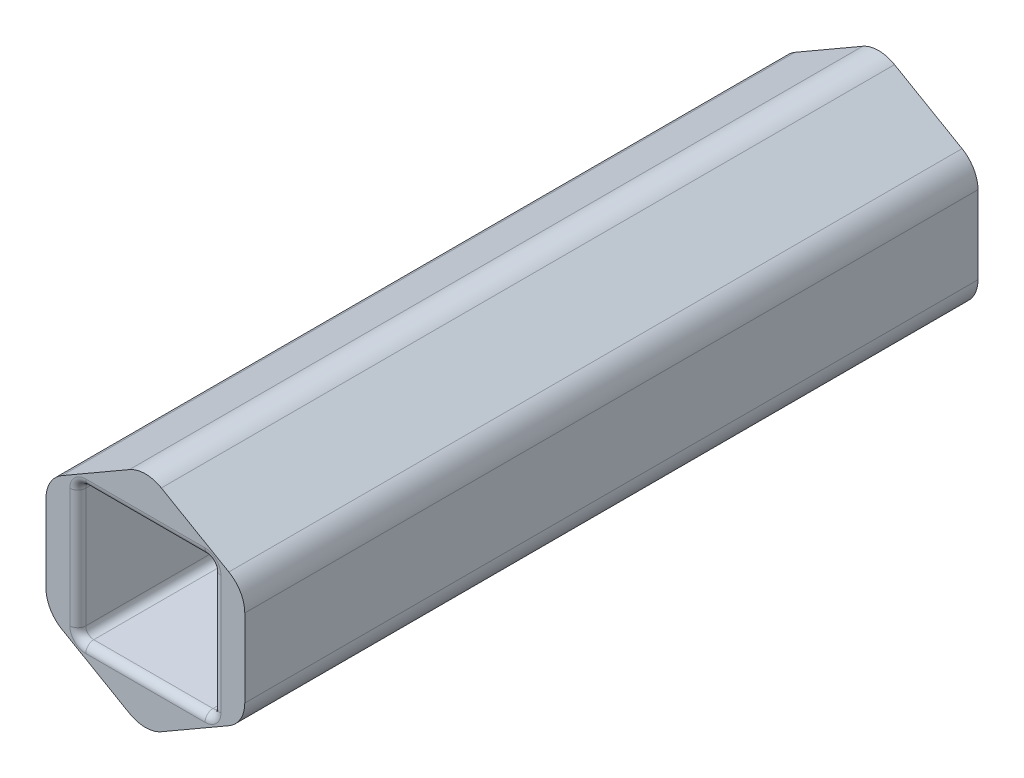
ISO-10303-21;
HEADER;
FILE_DESCRIPTION(('STEP AP214'),'2;1');
FILE_NAME('part.step','',(''),(''),'','','');
FILE_SCHEMA(('AUTOMOTIVE_DESIGN { 1 0 10303 214 1 1 1 1 }'));
ENDSEC;
DATA;
#1=APPLICATION_CONTEXT('core data for automotive mechanical design processes');
#2=APPLICATION_PROTOCOL_DEFINITION('international standard','automotive_design',2000,#1);
#3=PRODUCT_CONTEXT('',#1,'mechanical');
#4=PRODUCT('Part','Part','',(#3));
#5=PRODUCT_RELATED_PRODUCT_CATEGORY('part','',(#4));
#6=PRODUCT_DEFINITION_FORMATION('','',#4);
#7=PRODUCT_DEFINITION_CONTEXT('part definition',#1,'design');
#8=PRODUCT_DEFINITION('design','',#6,#7);
#9=PRODUCT_DEFINITION_SHAPE('','',#8);
#10=(LENGTH_UNIT() NAMED_UNIT(*) SI_UNIT(.MILLI.,.METRE.));
#11=(NAMED_UNIT(*) PLANE_ANGLE_UNIT() SI_UNIT($,.RADIAN.));
#12=(NAMED_UNIT(*) SI_UNIT($,.STERADIAN.) SOLID_ANGLE_UNIT());
#13=UNCERTAINTY_MEASURE_WITH_UNIT(LENGTH_MEASURE(1.E-05),#10,'distance_accuracy_value','');
#14=(GEOMETRIC_REPRESENTATION_CONTEXT(3) GLOBAL_UNCERTAINTY_ASSIGNED_CONTEXT((#13)) GLOBAL_UNIT_ASSIGNED_CONTEXT((#10,
#11,#12)) REPRESENTATION_CONTEXT('',''));
#15=CARTESIAN_POINT('',(0.,0.,0.));
#16=DIRECTION('',(0.,0.,1.));
#17=DIRECTION('',(1.,0.,0.));
#18=AXIS2_PLACEMENT_3D('',#15,#16,#17);
#19=CARTESIAN_POINT('',(0.,0.,36.5125));
#20=DIRECTION('',(0.,0.,1.));
#21=DIRECTION('',(1.,0.,0.));
#22=AXIS2_PLACEMENT_3D('',#19,#20,#21);
#23=PLANE('',#22);
#24=CARTESIAN_POINT('',(-2.968625,-2.968625,36.5125));
#25=DIRECTION('',(0.,0.,1.));
#26=DIRECTION('',(1.,0.,0.));
#27=AXIS2_PLACEMENT_3D('',#24,#25,#26);
#28=CIRCLE('',#27,0.79375);
#29=CARTESIAN_POINT('',(-3.762375,-2.968625,36.5125));
#30=VERTEX_POINT('',#29);
#31=CARTESIAN_POINT('',(-2.968625,-3.762375,36.5125));
#32=VERTEX_POINT('',#31);
#33=EDGE_CURVE('E355',#30,#32,#28,.T.);
#34=ORIENTED_EDGE('',*,*,#33,.F.);
#35=DIRECTION('',(0.,-1.,0.));
#36=VECTOR('',#35,1.);
#37=CARTESIAN_POINT('',(-3.762375,0.,36.5125));
#38=LINE('',#37,#36);
#39=CARTESIAN_POINT('',(-3.762375,2.968625,36.5125));
#40=VERTEX_POINT('',#39);
#41=EDGE_CURVE('E359',#30,#40,#38,.F.);
#42=ORIENTED_EDGE('',*,*,#41,.T.);
#43=CARTESIAN_POINT('',(-2.968625,2.968625,36.5125));
#44=DIRECTION('',(0.,0.,1.));
#45=DIRECTION('',(1.,0.,0.));
#46=AXIS2_PLACEMENT_3D('',#43,#44,#45);
#47=CIRCLE('',#46,0.79375);
#48=CARTESIAN_POINT('',(-2.968625,3.762375,36.5125));
#49=VERTEX_POINT('',#48);
#50=EDGE_CURVE('E356',#49,#40,#47,.T.);
#51=ORIENTED_EDGE('',*,*,#50,.F.);
#52=DIRECTION('',(-1.,0.,0.));
#53=VECTOR('',#52,1.);
#54=CARTESIAN_POINT('',(0.,3.762375,36.5125));
#55=LINE('',#54,#53);
#56=CARTESIAN_POINT('',(2.968625,3.762375,36.5125));
#57=VERTEX_POINT('',#56);
#58=EDGE_CURVE('E346',#49,#57,#55,.F.);
#59=ORIENTED_EDGE('',*,*,#58,.T.);
#60=CARTESIAN_POINT('',(2.968625,2.968625,36.5125));
#61=DIRECTION('',(0.,0.,1.));
#62=DIRECTION('',(1.,0.,0.));
#63=AXIS2_PLACEMENT_3D('',#60,#61,#62);
#64=CIRCLE('',#63,0.79375);
#65=CARTESIAN_POINT('',(3.762375,2.968625,36.5125));
#66=VERTEX_POINT('',#65);
#67=EDGE_CURVE('E342',#66,#57,#64,.T.);
#68=ORIENTED_EDGE('',*,*,#67,.F.);
#69=DIRECTION('',(0.,1.,0.));
#70=VECTOR('',#69,1.);
#71=CARTESIAN_POINT('',(3.762375,0.,36.5125));
#72=LINE('',#71,#70);
#73=CARTESIAN_POINT('',(3.762375,-2.968625,36.5125));
#74=VERTEX_POINT('',#73);
#75=EDGE_CURVE('E339',#66,#74,#72,.F.);
#76=ORIENTED_EDGE('',*,*,#75,.T.);
#77=CARTESIAN_POINT('',(2.968625,-2.968625,36.5125));
#78=DIRECTION('',(0.,0.,1.));
#79=DIRECTION('',(1.,0.,0.));
#80=AXIS2_PLACEMENT_3D('',#77,#78,#79);
#81=CIRCLE('',#80,0.79375);
#82=CARTESIAN_POINT('',(2.968625,-3.762375,36.5125));
#83=VERTEX_POINT('',#82);
#84=EDGE_CURVE('E337',#83,#74,#81,.T.);
#85=ORIENTED_EDGE('',*,*,#84,.F.);
#86=DIRECTION('',(1.,0.,0.));
#87=VECTOR('',#86,1.);
#88=CARTESIAN_POINT('',(0.,-3.762375,36.5125));
#89=LINE('',#88,#87);
#90=EDGE_CURVE('E345',#83,#32,#89,.F.);
#91=ORIENTED_EDGE('',*,*,#90,.T.);
#92=EDGE_LOOP('',(#34,#42,#51,#59,#68,#76,#85,#91));
#93=FACE_BOUND('',#92,.T.);
#94=DIRECTION('',(0.,1.,0.));
#95=VECTOR('',#94,1.);
#96=CARTESIAN_POINT('',(4.94933518262806,-2.8575,36.5125));
#97=LINE('',#96,#95);
#98=CARTESIAN_POINT('',(4.94933518262806,-1.94095644766147,36.5125));
#99=VERTEX_POINT('',#98);
#100=CARTESIAN_POINT('',(4.94933518262806,1.94095644766147,36.5125));
#101=VERTEX_POINT('',#100);
#102=EDGE_CURVE('E609',#99,#101,#97,.T.);
#103=ORIENTED_EDGE('',*,*,#102,.T.);
#104=CARTESIAN_POINT('',(3.36183518262806,1.94095644766147,36.5125));
#105=DIRECTION('',(0.,0.,1.));
#106=DIRECTION('',(1.,0.,0.));
#107=AXIS2_PLACEMENT_3D('',#104,#105,#106);
#108=CIRCLE('',#107,1.5875);
#109=CARTESIAN_POINT('',(4.15558518262806,3.31577177616927,36.5125));
#110=VERTEX_POINT('',#109);
#111=EDGE_CURVE('E543',#101,#110,#108,.T.);
#112=ORIENTED_EDGE('',*,*,#111,.T.);
#113=DIRECTION('',(-0.866025403784439,0.5,0.));
#114=VECTOR('',#113,1.);
#115=CARTESIAN_POINT('',(4.94933518262806,2.8575,36.5125));
#116=LINE('',#115,#114);
#117=CARTESIAN_POINT('',(0.793749999999999,5.25672822383074,36.5125));
#118=VERTEX_POINT('',#117);
#119=EDGE_CURVE('E603',#110,#118,#116,.T.);
#120=ORIENTED_EDGE('',*,*,#119,.T.);
#121=CARTESIAN_POINT('',(0.,3.88191289532294,36.5125));
#122=DIRECTION('',(0.,0.,1.));
#123=DIRECTION('',(1.,0.,0.));
#124=AXIS2_PLACEMENT_3D('',#121,#122,#123);
#125=CIRCLE('',#124,1.5875);
#126=CARTESIAN_POINT('',(-0.79375,5.25672822383074,36.5125));
#127=VERTEX_POINT('',#126);
#128=EDGE_CURVE('E529',#118,#127,#125,.T.);
#129=ORIENTED_EDGE('',*,*,#128,.T.);
#130=DIRECTION('',(-0.866025403784439,-0.5,0.));
#131=VECTOR('',#130,1.);
#132=CARTESIAN_POINT('',(0.,5.715,36.5125));
#133=LINE('',#132,#131);
#134=CARTESIAN_POINT('',(-4.15558518262807,3.31577177616927,36.5125));
#135=VERTEX_POINT('',#134);
#136=EDGE_CURVE('E576',#127,#135,#133,.T.);
#137=ORIENTED_EDGE('',*,*,#136,.T.);
#138=CARTESIAN_POINT('',(-3.36183518262807,1.94095644766147,36.5125));
#139=DIRECTION('',(0.,0.,1.));
#140=DIRECTION('',(1.,0.,0.));
#141=AXIS2_PLACEMENT_3D('',#138,#139,#140);
#142=CIRCLE('',#141,1.5875);
#143=CARTESIAN_POINT('',(-4.94933518262807,1.94095644766147,36.5125));
#144=VERTEX_POINT('',#143);
#145=EDGE_CURVE('E531',#135,#144,#142,.T.);
#146=ORIENTED_EDGE('',*,*,#145,.T.);
#147=DIRECTION('',(0.,-1.,0.));
#148=VECTOR('',#147,1.);
#149=CARTESIAN_POINT('',(-4.94933518262807,2.8575,36.5125));
#150=LINE('',#149,#148);
#151=CARTESIAN_POINT('',(-4.94933518262807,-1.94095644766147,36.5125));
#152=VERTEX_POINT('',#151);
#153=EDGE_CURVE('E326',#144,#152,#150,.T.);
#154=ORIENTED_EDGE('',*,*,#153,.T.);
#155=CARTESIAN_POINT('',(-3.36183518262807,-1.94095644766147,36.5125));
#156=DIRECTION('',(0.,0.,1.));
#157=DIRECTION('',(1.,0.,0.));
#158=AXIS2_PLACEMENT_3D('',#155,#156,#157);
#159=CIRCLE('',#158,1.5875);
#160=CARTESIAN_POINT('',(-4.15558518262807,-3.31577177616927,36.5125));
#161=VERTEX_POINT('',#160);
#162=EDGE_CURVE('E72',#152,#161,#159,.T.);
#163=ORIENTED_EDGE('',*,*,#162,.T.);
#164=DIRECTION('',(0.866025403784439,-0.5,0.));
#165=VECTOR('',#164,1.);
#166=CARTESIAN_POINT('',(-4.94933518262807,-2.8575,36.5125));
#167=LINE('',#166,#165);
#168=CARTESIAN_POINT('',(-0.79375,-5.25672822383073,36.5125));
#169=VERTEX_POINT('',#168);
#170=EDGE_CURVE('E321',#161,#169,#167,.T.);
#171=ORIENTED_EDGE('',*,*,#170,.T.);
#172=CARTESIAN_POINT('',(0.,-3.88191289532294,36.5125));
#173=DIRECTION('',(0.,0.,1.));
#174=DIRECTION('',(1.,0.,0.));
#175=AXIS2_PLACEMENT_3D('',#172,#173,#174);
#176=CIRCLE('',#175,1.5875);
#177=CARTESIAN_POINT('',(0.793750000000001,-5.25672822383073,36.5125));
#178=VERTEX_POINT('',#177);
#179=EDGE_CURVE('E538',#169,#178,#176,.T.);
#180=ORIENTED_EDGE('',*,*,#179,.T.);
#181=DIRECTION('',(0.866025403784438,0.500000000000001,0.));
#182=VECTOR('',#181,1.);
#183=CARTESIAN_POINT('',(0.,-5.715,36.5125));
#184=LINE('',#183,#182);
#185=CARTESIAN_POINT('',(4.15558518262806,-3.31577177616926,36.5125));
#186=VERTEX_POINT('',#185);
#187=EDGE_CURVE('E615',#178,#186,#184,.T.);
#188=ORIENTED_EDGE('',*,*,#187,.T.);
#189=CARTESIAN_POINT('',(3.36183518262806,-1.94095644766147,36.5125));
#190=DIRECTION('',(0.,0.,1.));
#191=DIRECTION('',(1.,0.,0.));
#192=AXIS2_PLACEMENT_3D('',#189,#190,#191);
#193=CIRCLE('',#192,1.5875);
#194=EDGE_CURVE('E539',#186,#99,#193,.T.);
#195=ORIENTED_EDGE('',*,*,#194,.T.);
#196=EDGE_LOOP('',(#103,#112,#120,#129,#137,#146,#154,#163,#171,#180,#188,#195));
#197=FACE_BOUND('',#196,.T.);
#198=ADVANCED_FACE('F44',(#93,#197),#23,.T.);
#199=CARTESIAN_POINT('',(0.,0.,0.));
#200=DIRECTION('',(0.,0.,1.));
#201=DIRECTION('',(1.,0.,0.));
#202=AXIS2_PLACEMENT_3D('',#199,#200,#201);
#203=PLANE('',#202);
#204=CARTESIAN_POINT('',(2.968625,2.968625,0.));
#205=DIRECTION('',(0.,0.,1.));
#206=DIRECTION('',(1.,0.,0.));
#207=AXIS2_PLACEMENT_3D('',#204,#205,#206);
#208=CIRCLE('',#207,0.79375);
#209=CARTESIAN_POINT('',(2.968625,3.762375,0.));
#210=VERTEX_POINT('',#209);
#211=CARTESIAN_POINT('',(3.762375,2.968625,0.));
#212=VERTEX_POINT('',#211);
#213=EDGE_CURVE('E361',#210,#212,#208,.F.);
#214=ORIENTED_EDGE('',*,*,#213,.F.);
#215=DIRECTION('',(-1.,0.,0.));
#216=VECTOR('',#215,1.);
#217=CARTESIAN_POINT('',(-3.3655,3.762375,0.));
#218=LINE('',#217,#216);
#219=CARTESIAN_POINT('',(-2.968625,3.762375,0.));
#220=VERTEX_POINT('',#219);
#221=EDGE_CURVE('E298',#210,#220,#218,.T.);
#222=ORIENTED_EDGE('',*,*,#221,.T.);
#223=CARTESIAN_POINT('',(-2.968625,2.968625,0.));
#224=DIRECTION('',(0.,0.,1.));
#225=DIRECTION('',(1.,0.,0.));
#226=AXIS2_PLACEMENT_3D('',#223,#224,#225);
#227=CIRCLE('',#226,0.79375);
#228=CARTESIAN_POINT('',(-3.762375,2.968625,0.));
#229=VERTEX_POINT('',#228);
#230=EDGE_CURVE('E382',#229,#220,#227,.F.);
#231=ORIENTED_EDGE('',*,*,#230,.F.);
#232=DIRECTION('',(0.,-1.,0.));
#233=VECTOR('',#232,1.);
#234=CARTESIAN_POINT('',(-3.762375,-3.3655,0.));
#235=LINE('',#234,#233);
#236=CARTESIAN_POINT('',(-3.762375,-2.968625,0.));
#237=VERTEX_POINT('',#236);
#238=EDGE_CURVE('E379',#229,#237,#235,.T.);
#239=ORIENTED_EDGE('',*,*,#238,.T.);
#240=CARTESIAN_POINT('',(-2.968625,-2.968625,0.));
#241=DIRECTION('',(0.,0.,1.));
#242=DIRECTION('',(1.,0.,0.));
#243=AXIS2_PLACEMENT_3D('',#240,#241,#242);
#244=CIRCLE('',#243,0.79375);
#245=CARTESIAN_POINT('',(-2.968625,-3.762375,0.));
#246=VERTEX_POINT('',#245);
#247=EDGE_CURVE('E376',#246,#237,#244,.F.);
#248=ORIENTED_EDGE('',*,*,#247,.F.);
#249=DIRECTION('',(1.,0.,0.));
#250=VECTOR('',#249,1.);
#251=CARTESIAN_POINT('',(3.3655,-3.762375,0.));
#252=LINE('',#251,#250);
#253=CARTESIAN_POINT('',(2.968625,-3.762375,0.));
#254=VERTEX_POINT('',#253);
#255=EDGE_CURVE('E373',#246,#254,#252,.T.);
#256=ORIENTED_EDGE('',*,*,#255,.T.);
#257=CARTESIAN_POINT('',(2.968625,-2.968625,0.));
#258=DIRECTION('',(0.,0.,1.));
#259=DIRECTION('',(1.,0.,0.));
#260=AXIS2_PLACEMENT_3D('',#257,#258,#259);
#261=CIRCLE('',#260,0.79375);
#262=CARTESIAN_POINT('',(3.762375,-2.968625,0.));
#263=VERTEX_POINT('',#262);
#264=EDGE_CURVE('E369',#263,#254,#261,.F.);
#265=ORIENTED_EDGE('',*,*,#264,.F.);
#266=DIRECTION('',(0.,1.,0.));
#267=VECTOR('',#266,1.);
#268=CARTESIAN_POINT('',(3.762375,3.3655,0.));
#269=LINE('',#268,#267);
#270=EDGE_CURVE('E368',#263,#212,#269,.T.);
#271=ORIENTED_EDGE('',*,*,#270,.T.);
#272=EDGE_LOOP('',(#214,#222,#231,#239,#248,#256,#265,#271));
#273=FACE_BOUND('',#272,.T.);
#274=DIRECTION('',(-0.866025403784439,0.5,0.));
#275=VECTOR('',#274,1.);
#276=CARTESIAN_POINT('',(4.94933518262806,2.8575,0.));
#277=LINE('',#276,#275);
#278=CARTESIAN_POINT('',(4.15558518262806,3.31577177616927,0.));
#279=VERTEX_POINT('',#278);
#280=CARTESIAN_POINT('',(0.793749999999999,5.25672822383074,0.));
#281=VERTEX_POINT('',#280);
#282=EDGE_CURVE('E588',#279,#281,#277,.T.);
#283=ORIENTED_EDGE('',*,*,#282,.F.);
#284=CARTESIAN_POINT('',(3.36183518262806,1.94095644766147,0.));
#285=DIRECTION('',(0.,0.,1.));
#286=DIRECTION('',(1.,0.,0.));
#287=AXIS2_PLACEMENT_3D('',#284,#285,#286);
#288=CIRCLE('',#287,1.5875);
#289=CARTESIAN_POINT('',(4.94933518262806,1.94095644766147,0.));
#290=VERTEX_POINT('',#289);
#291=EDGE_CURVE('E516',#279,#290,#288,.F.);
#292=ORIENTED_EDGE('',*,*,#291,.T.);
#293=DIRECTION('',(0.,1.,0.));
#294=VECTOR('',#293,1.);
#295=CARTESIAN_POINT('',(4.94933518262806,-2.8575,0.));
#296=LINE('',#295,#294);
#297=CARTESIAN_POINT('',(4.94933518262806,-1.94095644766147,0.));
#298=VERTEX_POINT('',#297);
#299=EDGE_CURVE('E591',#298,#290,#296,.T.);
#300=ORIENTED_EDGE('',*,*,#299,.F.);
#301=CARTESIAN_POINT('',(3.36183518262806,-1.94095644766147,0.));
#302=DIRECTION('',(0.,0.,1.));
#303=DIRECTION('',(1.,0.,0.));
#304=AXIS2_PLACEMENT_3D('',#301,#302,#303);
#305=CIRCLE('',#304,1.5875);
#306=CARTESIAN_POINT('',(4.15558518262806,-3.31577177616926,0.));
#307=VERTEX_POINT('',#306);
#308=EDGE_CURVE('E520',#298,#307,#305,.F.);
#309=ORIENTED_EDGE('',*,*,#308,.T.);
#310=DIRECTION('',(0.866025403784438,0.500000000000001,0.));
#311=VECTOR('',#310,1.);
#312=CARTESIAN_POINT('',(0.,-5.715,0.));
#313=LINE('',#312,#311);
#314=CARTESIAN_POINT('',(0.793750000000001,-5.25672822383073,0.));
#315=VERTEX_POINT('',#314);
#316=EDGE_CURVE('E498',#315,#307,#313,.T.);
#317=ORIENTED_EDGE('',*,*,#316,.F.);
#318=CARTESIAN_POINT('',(0.,-3.88191289532294,0.));
#319=DIRECTION('',(0.,0.,1.));
#320=DIRECTION('',(1.,0.,0.));
#321=AXIS2_PLACEMENT_3D('',#318,#319,#320);
#322=CIRCLE('',#321,1.5875);
#323=CARTESIAN_POINT('',(-0.79375,-5.25672822383073,0.));
#324=VERTEX_POINT('',#323);
#325=EDGE_CURVE('E514',#315,#324,#322,.F.);
#326=ORIENTED_EDGE('',*,*,#325,.T.);
#327=DIRECTION('',(0.866025403784439,-0.5,0.));
#328=VECTOR('',#327,1.);
#329=CARTESIAN_POINT('',(-4.94933518262807,-2.8575,0.));
#330=LINE('',#329,#328);
#331=CARTESIAN_POINT('',(-4.15558518262807,-3.31577177616927,0.));
#332=VERTEX_POINT('',#331);
#333=EDGE_CURVE('E328',#332,#324,#330,.T.);
#334=ORIENTED_EDGE('',*,*,#333,.F.);
#335=CARTESIAN_POINT('',(-3.36183518262807,-1.94095644766147,0.));
#336=DIRECTION('',(0.,0.,1.));
#337=DIRECTION('',(1.,0.,0.));
#338=AXIS2_PLACEMENT_3D('',#335,#336,#337);
#339=CIRCLE('',#338,1.5875);
#340=CARTESIAN_POINT('',(-4.94933518262807,-1.94095644766147,0.));
#341=VERTEX_POINT('',#340);
#342=EDGE_CURVE('E512',#332,#341,#339,.F.);
#343=ORIENTED_EDGE('',*,*,#342,.T.);
#344=DIRECTION('',(0.,-1.,0.));
#345=VECTOR('',#344,1.);
#346=CARTESIAN_POINT('',(-4.94933518262807,2.8575,0.));
#347=LINE('',#346,#345);
#348=CARTESIAN_POINT('',(-4.94933518262807,1.94095644766147,0.));
#349=VERTEX_POINT('',#348);
#350=EDGE_CURVE('E584',#349,#341,#347,.T.);
#351=ORIENTED_EDGE('',*,*,#350,.F.);
#352=CARTESIAN_POINT('',(-3.36183518262807,1.94095644766147,0.));
#353=DIRECTION('',(0.,0.,1.));
#354=DIRECTION('',(1.,0.,0.));
#355=AXIS2_PLACEMENT_3D('',#352,#353,#354);
#356=CIRCLE('',#355,1.5875);
#357=CARTESIAN_POINT('',(-4.15558518262807,3.31577177616927,0.));
#358=VERTEX_POINT('',#357);
#359=EDGE_CURVE('E508',#349,#358,#356,.F.);
#360=ORIENTED_EDGE('',*,*,#359,.T.);
#361=DIRECTION('',(-0.866025403784439,-0.5,0.));
#362=VECTOR('',#361,1.);
#363=CARTESIAN_POINT('',(0.,5.715,0.));
#364=LINE('',#363,#362);
#365=CARTESIAN_POINT('',(-0.79375,5.25672822383074,0.));
#366=VERTEX_POINT('',#365);
#367=EDGE_CURVE('E573',#366,#358,#364,.T.);
#368=ORIENTED_EDGE('',*,*,#367,.F.);
#369=CARTESIAN_POINT('',(0.,3.88191289532294,0.));
#370=DIRECTION('',(0.,0.,1.));
#371=DIRECTION('',(1.,0.,0.));
#372=AXIS2_PLACEMENT_3D('',#369,#370,#371);
#373=CIRCLE('',#372,1.5875);
#374=EDGE_CURVE('E506',#366,#281,#373,.F.);
#375=ORIENTED_EDGE('',*,*,#374,.T.);
#376=EDGE_LOOP('',(#283,#292,#300,#309,#317,#326,#334,#343,#351,#360,#368,#375));
#377=FACE_BOUND('',#376,.T.);
#378=ADVANCED_FACE('F583',(#273,#377),#203,.F.);
#379=CARTESIAN_POINT('',(0.,-5.715,36.5125));
#380=DIRECTION('',(-0.500000000000001,0.866025403784438,0.));
#381=DIRECTION('',(-0.866025403784438,-0.500000000000001,0.));
#382=AXIS2_PLACEMENT_3D('',#379,#380,#381);
#383=PLANE('',#382);
#384=ORIENTED_EDGE('',*,*,#316,.T.);
#385=DIRECTION('',(0.,0.,-1.));
#386=VECTOR('',#385,1.);
#387=CARTESIAN_POINT('',(4.15558518262806,-3.31577177616926,36.5125));
#388=LINE('',#387,#386);
#389=EDGE_CURVE('E549',#307,#186,#388,.F.);
#390=ORIENTED_EDGE('',*,*,#389,.T.);
#391=ORIENTED_EDGE('',*,*,#187,.F.);
#392=DIRECTION('',(0.,0.,-1.));
#393=VECTOR('',#392,1.);
#394=CARTESIAN_POINT('',(0.793750000000001,-5.25672822383073,36.5125));
#395=LINE('',#394,#393);
#396=EDGE_CURVE('E546',#178,#315,#395,.T.);
#397=ORIENTED_EDGE('',*,*,#396,.T.);
#398=EDGE_LOOP('',(#384,#390,#391,#397));
#399=FACE_BOUND('',#398,.T.);
#400=ADVANCED_FACE('F623',(#399),#383,.F.);
#401=CARTESIAN_POINT('',(4.94933518262806,-2.8575,36.5125));
#402=DIRECTION('',(-1.,0.,0.));
#403=DIRECTION('',(0.,-1.,0.));
#404=AXIS2_PLACEMENT_3D('',#401,#402,#403);
#405=PLANE('',#404);
#406=ORIENTED_EDGE('',*,*,#299,.T.);
#407=DIRECTION('',(0.,0.,-1.));
#408=VECTOR('',#407,1.);
#409=CARTESIAN_POINT('',(4.94933518262806,1.94095644766147,36.5125));
#410=LINE('',#409,#408);
#411=EDGE_CURVE('E527',#290,#101,#410,.F.);
#412=ORIENTED_EDGE('',*,*,#411,.T.);
#413=ORIENTED_EDGE('',*,*,#102,.F.);
#414=DIRECTION('',(0.,0.,-1.));
#415=VECTOR('',#414,1.);
#416=CARTESIAN_POINT('',(4.94933518262806,-1.94095644766147,36.5125));
#417=LINE('',#416,#415);
#418=EDGE_CURVE('E523',#99,#298,#417,.T.);
#419=ORIENTED_EDGE('',*,*,#418,.T.);
#420=EDGE_LOOP('',(#406,#412,#413,#419));
#421=FACE_BOUND('',#420,.T.);
#422=ADVANCED_FACE('F632',(#421),#405,.F.);
#423=CARTESIAN_POINT('',(4.94933518262806,2.8575,36.5125));
#424=DIRECTION('',(-0.5,-0.866025403784439,0.));
#425=DIRECTION('',(0.866025403784439,-0.5,0.));
#426=AXIS2_PLACEMENT_3D('',#423,#424,#425);
#427=PLANE('',#426);
#428=ORIENTED_EDGE('',*,*,#119,.F.);
#429=DIRECTION('',(0.,0.,-1.));
#430=VECTOR('',#429,1.);
#431=CARTESIAN_POINT('',(4.15558518262806,3.31577177616927,36.5125));
#432=LINE('',#431,#430);
#433=EDGE_CURVE('E505',#110,#279,#432,.T.);
#434=ORIENTED_EDGE('',*,*,#433,.T.);
#435=ORIENTED_EDGE('',*,*,#282,.T.);
#436=DIRECTION('',(0.,0.,-1.));
#437=VECTOR('',#436,1.);
#438=CARTESIAN_POINT('',(0.793749999999999,5.25672822383074,36.5125));
#439=LINE('',#438,#437);
#440=EDGE_CURVE('E426',#281,#118,#439,.F.);
#441=ORIENTED_EDGE('',*,*,#440,.T.);
#442=EDGE_LOOP('',(#428,#434,#435,#441));
#443=FACE_BOUND('',#442,.T.);
#444=ADVANCED_FACE('F645',(#443),#427,.F.);
#445=CARTESIAN_POINT('',(0.,5.715,36.5125));
#446=DIRECTION('',(0.5,-0.866025403784439,0.));
#447=DIRECTION('',(0.866025403784439,0.5,0.));
#448=AXIS2_PLACEMENT_3D('',#445,#446,#447);
#449=PLANE('',#448);
#450=ORIENTED_EDGE('',*,*,#367,.T.);
#451=DIRECTION('',(0.,0.,-1.));
#452=VECTOR('',#451,1.);
#453=CARTESIAN_POINT('',(-4.15558518262807,3.31577177616927,36.5125));
#454=LINE('',#453,#452);
#455=EDGE_CURVE('E11',#358,#135,#454,.F.);
#456=ORIENTED_EDGE('',*,*,#455,.T.);
#457=ORIENTED_EDGE('',*,*,#136,.F.);
#458=DIRECTION('',(0.,0.,-1.));
#459=VECTOR('',#458,1.);
#460=CARTESIAN_POINT('',(-0.79375,5.25672822383074,36.5125));
#461=LINE('',#460,#459);
#462=EDGE_CURVE('E53',#127,#366,#461,.T.);
#463=ORIENTED_EDGE('',*,*,#462,.T.);
#464=EDGE_LOOP('',(#450,#456,#457,#463));
#465=FACE_BOUND('',#464,.T.);
#466=ADVANCED_FACE('F575',(#465),#449,.F.);
#467=CARTESIAN_POINT('',(-4.94933518262807,2.8575,36.5125));
#468=DIRECTION('',(1.,0.,0.));
#469=DIRECTION('',(0.,1.,0.));
#470=AXIS2_PLACEMENT_3D('',#467,#468,#469);
#471=PLANE('',#470);
#472=ORIENTED_EDGE('',*,*,#350,.T.);
#473=DIRECTION('',(0.,0.,-1.));
#474=VECTOR('',#473,1.);
#475=CARTESIAN_POINT('',(-4.94933518262807,-1.94095644766147,36.5125));
#476=LINE('',#475,#474);
#477=EDGE_CURVE('E563',#341,#152,#476,.F.);
#478=ORIENTED_EDGE('',*,*,#477,.T.);
#479=ORIENTED_EDGE('',*,*,#153,.F.);
#480=DIRECTION('',(0.,0.,-1.));
#481=VECTOR('',#480,1.);
#482=CARTESIAN_POINT('',(-4.94933518262807,1.94095644766147,36.5125));
#483=LINE('',#482,#481);
#484=EDGE_CURVE('E559',#144,#349,#483,.T.);
#485=ORIENTED_EDGE('',*,*,#484,.T.);
#486=EDGE_LOOP('',(#472,#478,#479,#485));
#487=FACE_BOUND('',#486,.T.);
#488=ADVANCED_FACE('F649',(#487),#471,.F.);
#489=CARTESIAN_POINT('',(-4.94933518262807,-2.8575,36.5125));
#490=DIRECTION('',(0.5,0.866025403784439,0.));
#491=DIRECTION('',(-0.866025403784439,0.5,0.));
#492=AXIS2_PLACEMENT_3D('',#489,#490,#491);
#493=PLANE('',#492);
#494=ORIENTED_EDGE('',*,*,#333,.T.);
#495=DIRECTION('',(0.,0.,-1.));
#496=VECTOR('',#495,1.);
#497=CARTESIAN_POINT('',(-0.79375,-5.25672822383073,36.5125));
#498=LINE('',#497,#496);
#499=EDGE_CURVE('E62',#324,#169,#498,.F.);
#500=ORIENTED_EDGE('',*,*,#499,.T.);
#501=ORIENTED_EDGE('',*,*,#170,.F.);
#502=DIRECTION('',(0.,0.,-1.));
#503=VECTOR('',#502,1.);
#504=CARTESIAN_POINT('',(-4.15558518262807,-3.31577177616927,36.5125));
#505=LINE('',#504,#503);
#506=EDGE_CURVE('E554',#161,#332,#505,.T.);
#507=ORIENTED_EDGE('',*,*,#506,.T.);
#508=EDGE_LOOP('',(#494,#500,#501,#507));
#509=FACE_BOUND('',#508,.T.);
#510=ADVANCED_FACE('F618',(#509),#493,.F.);
#511=CARTESIAN_POINT('',(3.3655,-3.3655,36.5125));
#512=DIRECTION('',(-1.,0.,0.));
#513=DIRECTION('',(0.,0.,1.));
#514=AXIS2_PLACEMENT_3D('',#511,#512,#513);
#515=PLANE('',#514);
#516=DIRECTION('',(0.,1.,0.));
#517=VECTOR('',#516,1.);
#518=CARTESIAN_POINT('',(3.3655,-3.3655,36.115625));
#519=LINE('',#518,#517);
#520=CARTESIAN_POINT('',(3.3655,-2.968625,36.115625));
#521=VERTEX_POINT('',#520);
#522=CARTESIAN_POINT('',(3.3655,2.968625,36.115625));
#523=VERTEX_POINT('',#522);
#524=EDGE_CURVE('E420',#521,#523,#519,.T.);
#525=ORIENTED_EDGE('',*,*,#524,.T.);
#526=DIRECTION('',(0.,0.,-1.));
#527=VECTOR('',#526,1.);
#528=CARTESIAN_POINT('',(3.3655,2.968625,0.));
#529=LINE('',#528,#527);
#530=CARTESIAN_POINT('',(3.3655,2.968625,0.396875));
#531=VERTEX_POINT('',#530);
#532=EDGE_CURVE('E425',#523,#531,#529,.T.);
#533=ORIENTED_EDGE('',*,*,#532,.T.);
#534=DIRECTION('',(0.,1.,0.));
#535=VECTOR('',#534,1.);
#536=CARTESIAN_POINT('',(3.3655,-3.3655,0.396875));
#537=LINE('',#536,#535);
#538=CARTESIAN_POINT('',(3.3655,-2.968625,0.396875));
#539=VERTEX_POINT('',#538);
#540=EDGE_CURVE('E413',#531,#539,#537,.F.);
#541=ORIENTED_EDGE('',*,*,#540,.T.);
#542=DIRECTION('',(0.,0.,-1.));
#543=VECTOR('',#542,1.);
#544=CARTESIAN_POINT('',(3.3655,-2.968625,36.5125));
#545=LINE('',#544,#543);
#546=EDGE_CURVE('E418',#539,#521,#545,.F.);
#547=ORIENTED_EDGE('',*,*,#546,.T.);
#548=EDGE_LOOP('',(#525,#533,#541,#547));
#549=FACE_BOUND('',#548,.T.);
#550=ADVANCED_FACE('F673',(#549),#515,.T.);
#551=CARTESIAN_POINT('',(-3.3655,3.3655,36.5125));
#552=DIRECTION('',(0.,-1.,0.));
#553=DIRECTION('',(0.,0.,-1.));
#554=AXIS2_PLACEMENT_3D('',#551,#552,#553);
#555=PLANE('',#554);
#556=DIRECTION('',(-1.,0.,0.));
#557=VECTOR('',#556,1.);
#558=CARTESIAN_POINT('',(-3.3655,3.3655,36.115625));
#559=LINE('',#558,#557);
#560=CARTESIAN_POINT('',(2.968625,3.3655,36.115625));
#561=VERTEX_POINT('',#560);
#562=CARTESIAN_POINT('',(-2.968625,3.3655,36.115625));
#563=VERTEX_POINT('',#562);
#564=EDGE_CURVE('E289',#561,#563,#559,.T.);
#565=ORIENTED_EDGE('',*,*,#564,.T.);
#566=DIRECTION('',(0.,0.,-1.));
#567=VECTOR('',#566,1.);
#568=CARTESIAN_POINT('',(-2.968625,3.3655,0.));
#569=LINE('',#568,#567);
#570=CARTESIAN_POINT('',(-2.968625,3.3655,0.396875));
#571=VERTEX_POINT('',#570);
#572=EDGE_CURVE('E281',#563,#571,#569,.T.);
#573=ORIENTED_EDGE('',*,*,#572,.T.);
#574=DIRECTION('',(-1.,0.,0.));
#575=VECTOR('',#574,1.);
#576=CARTESIAN_POINT('',(3.3655,3.3655,0.396875));
#577=LINE('',#576,#575);
#578=CARTESIAN_POINT('',(2.968625,3.3655,0.396875));
#579=VERTEX_POINT('',#578);
#580=EDGE_CURVE('E280',#571,#579,#577,.F.);
#581=ORIENTED_EDGE('',*,*,#580,.T.);
#582=DIRECTION('',(0.,0.,-1.));
#583=VECTOR('',#582,1.);
#584=CARTESIAN_POINT('',(2.968625,3.3655,36.5125));
#585=LINE('',#584,#583);
#586=EDGE_CURVE('E285',#579,#561,#585,.F.);
#587=ORIENTED_EDGE('',*,*,#586,.T.);
#588=EDGE_LOOP('',(#565,#573,#581,#587));
#589=FACE_BOUND('',#588,.T.);
#590=ADVANCED_FACE('F278',(#589),#555,.T.);
#591=CARTESIAN_POINT('',(-3.3655,-3.3655,36.5125));
#592=DIRECTION('',(1.,0.,0.));
#593=DIRECTION('',(0.,0.,-1.));
#594=AXIS2_PLACEMENT_3D('',#591,#592,#593);
#595=PLANE('',#594);
#596=DIRECTION('',(0.,0.,-1.));
#597=VECTOR('',#596,1.);
#598=CARTESIAN_POINT('',(-3.3655,2.968625,36.5125));
#599=LINE('',#598,#597);
#600=CARTESIAN_POINT('',(-3.3655,2.968625,0.396875));
#601=VERTEX_POINT('',#600);
#602=CARTESIAN_POINT('',(-3.3655,2.968625,36.115625));
#603=VERTEX_POINT('',#602);
#604=EDGE_CURVE('E394',#601,#603,#599,.F.);
#605=ORIENTED_EDGE('',*,*,#604,.T.);
#606=DIRECTION('',(0.,-1.,0.));
#607=VECTOR('',#606,1.);
#608=CARTESIAN_POINT('',(-3.3655,-3.3655,36.115625));
#609=LINE('',#608,#607);
#610=CARTESIAN_POINT('',(-3.3655,-2.968625,36.115625));
#611=VERTEX_POINT('',#610);
#612=EDGE_CURVE('E400',#603,#611,#609,.T.);
#613=ORIENTED_EDGE('',*,*,#612,.T.);
#614=DIRECTION('',(0.,0.,-1.));
#615=VECTOR('',#614,1.);
#616=CARTESIAN_POINT('',(-3.3655,-2.968625,0.));
#617=LINE('',#616,#615);
#618=CARTESIAN_POINT('',(-3.3655,-2.968625,0.396875));
#619=VERTEX_POINT('',#618);
#620=EDGE_CURVE('E389',#611,#619,#617,.T.);
#621=ORIENTED_EDGE('',*,*,#620,.T.);
#622=DIRECTION('',(0.,-1.,0.));
#623=VECTOR('',#622,1.);
#624=CARTESIAN_POINT('',(-3.3655,3.3655,0.396875));
#625=LINE('',#624,#623);
#626=EDGE_CURVE('E392',#619,#601,#625,.F.);
#627=ORIENTED_EDGE('',*,*,#626,.T.);
#628=EDGE_LOOP('',(#605,#613,#621,#627));
#629=FACE_BOUND('',#628,.T.);
#630=ADVANCED_FACE('F912',(#629),#595,.T.);
#631=CARTESIAN_POINT('',(-3.3655,-3.3655,36.5125));
#632=DIRECTION('',(0.,1.,0.));
#633=DIRECTION('',(0.,0.,1.));
#634=AXIS2_PLACEMENT_3D('',#631,#632,#633);
#635=PLANE('',#634);
#636=DIRECTION('',(0.,0.,-1.));
#637=VECTOR('',#636,1.);
#638=CARTESIAN_POINT('',(-2.968625,-3.3655,36.5125));
#639=LINE('',#638,#637);
#640=CARTESIAN_POINT('',(-2.968625,-3.3655,0.396875));
#641=VERTEX_POINT('',#640);
#642=CARTESIAN_POINT('',(-2.968625,-3.3655,36.115625));
#643=VERTEX_POINT('',#642);
#644=EDGE_CURVE('E410',#641,#643,#639,.F.);
#645=ORIENTED_EDGE('',*,*,#644,.T.);
#646=DIRECTION('',(1.,0.,0.));
#647=VECTOR('',#646,1.);
#648=CARTESIAN_POINT('',(-3.3655,-3.3655,36.115625));
#649=LINE('',#648,#647);
#650=CARTESIAN_POINT('',(2.968625,-3.3655,36.115625));
#651=VERTEX_POINT('',#650);
#652=EDGE_CURVE('E409',#643,#651,#649,.T.);
#653=ORIENTED_EDGE('',*,*,#652,.T.);
#654=DIRECTION('',(0.,0.,-1.));
#655=VECTOR('',#654,1.);
#656=CARTESIAN_POINT('',(2.968625,-3.3655,0.));
#657=LINE('',#656,#655);
#658=CARTESIAN_POINT('',(2.968625,-3.3655,0.396875));
#659=VERTEX_POINT('',#658);
#660=EDGE_CURVE('E402',#651,#659,#657,.T.);
#661=ORIENTED_EDGE('',*,*,#660,.T.);
#662=DIRECTION('',(1.,0.,0.));
#663=VECTOR('',#662,1.);
#664=CARTESIAN_POINT('',(-3.3655,-3.3655,0.396875));
#665=LINE('',#664,#663);
#666=EDGE_CURVE('E404',#659,#641,#665,.F.);
#667=ORIENTED_EDGE('',*,*,#666,.T.);
#668=EDGE_LOOP('',(#645,#653,#661,#667));
#669=FACE_BOUND('',#668,.T.);
#670=ADVANCED_FACE('F758',(#669),#635,.T.);
#671=CARTESIAN_POINT('',(0.,-3.762375,0.396875));
#672=DIRECTION('',(-1.,0.,0.));
#673=DIRECTION('',(0.,0.,1.));
#674=AXIS2_PLACEMENT_3D('',#671,#672,#673);
#675=CYLINDRICAL_SURFACE('',#674,0.396875);
#676=CARTESIAN_POINT('',(2.968625,-3.762375,0.396875));
#677=DIRECTION('',(1.,0.,0.));
#678=DIRECTION('',(0.,0.,-1.));
#679=AXIS2_PLACEMENT_3D('',#676,#677,#678);
#680=CIRCLE('',#679,0.396875);
#681=EDGE_CURVE('E497',#254,#659,#680,.T.);
#682=ORIENTED_EDGE('',*,*,#681,.F.);
#683=ORIENTED_EDGE('',*,*,#255,.F.);
#684=CARTESIAN_POINT('',(-2.968625,-3.762375,0.396875));
#685=DIRECTION('',(-1.,0.,0.));
#686=DIRECTION('',(0.,0.,1.));
#687=AXIS2_PLACEMENT_3D('',#684,#685,#686);
#688=CIRCLE('',#687,0.396875);
#689=EDGE_CURVE('E495',#641,#246,#688,.T.);
#690=ORIENTED_EDGE('',*,*,#689,.F.);
#691=ORIENTED_EDGE('',*,*,#666,.F.);
#692=EDGE_LOOP('',(#682,#683,#690,#691));
#693=FACE_BOUND('',#692,.T.);
#694=ADVANCED_FACE('F754',(#693),#675,.T.);
#695=CARTESIAN_POINT('',(2.968625,-2.968625,0.396874999999998));
#696=DIRECTION('',(0.,0.,1.));
#697=DIRECTION('',(1.,0.,0.));
#698=AXIS2_PLACEMENT_3D('',#695,#696,#697);
#699=TOROIDAL_SURFACE('',#698,0.79375,0.396875);
#700=ORIENTED_EDGE('',*,*,#264,.T.);
#701=ORIENTED_EDGE('',*,*,#681,.T.);
#702=CARTESIAN_POINT('',(2.968625,-2.968625,0.396874999999998));
#703=DIRECTION('',(0.,0.,1.));
#704=DIRECTION('',(1.,0.,0.));
#705=AXIS2_PLACEMENT_3D('',#702,#703,#704);
#706=CIRCLE('',#705,0.396875);
#707=EDGE_CURVE('E488',#539,#659,#706,.F.);
#708=ORIENTED_EDGE('',*,*,#707,.F.);
#709=CARTESIAN_POINT('',(3.762375,-2.968625,0.396875));
#710=DIRECTION('',(0.,-1.,0.));
#711=DIRECTION('',(0.,0.,-1.));
#712=AXIS2_PLACEMENT_3D('',#709,#710,#711);
#713=CIRCLE('',#712,0.396875);
#714=EDGE_CURVE('E482',#263,#539,#713,.F.);
#715=ORIENTED_EDGE('',*,*,#714,.F.);
#716=EDGE_LOOP('',(#700,#701,#708,#715));
#717=FACE_BOUND('',#716,.T.);
#718=ADVANCED_FACE('F749',(#717),#699,.T.);
#719=CARTESIAN_POINT('',(-2.968625,-2.968625,0.396874999999998));
#720=DIRECTION('',(0.,0.,1.));
#721=DIRECTION('',(1.,0.,0.));
#722=AXIS2_PLACEMENT_3D('',#719,#720,#721);
#723=TOROIDAL_SURFACE('',#722,0.79375,0.396875);
#724=ORIENTED_EDGE('',*,*,#689,.T.);
#725=ORIENTED_EDGE('',*,*,#247,.T.);
#726=CARTESIAN_POINT('',(-3.762375,-2.968625,0.396875));
#727=DIRECTION('',(0.,-1.,0.));
#728=DIRECTION('',(0.,0.,-1.));
#729=AXIS2_PLACEMENT_3D('',#726,#727,#728);
#730=CIRCLE('',#729,0.396875);
#731=EDGE_CURVE('E477',#619,#237,#730,.F.);
#732=ORIENTED_EDGE('',*,*,#731,.F.);
#733=CARTESIAN_POINT('',(-2.968625,-2.968625,0.396874999999998));
#734=DIRECTION('',(0.,0.,1.));
#735=DIRECTION('',(1.,0.,0.));
#736=AXIS2_PLACEMENT_3D('',#733,#734,#735);
#737=CIRCLE('',#736,0.396875);
#738=EDGE_CURVE('E478',#641,#619,#737,.F.);
#739=ORIENTED_EDGE('',*,*,#738,.F.);
#740=EDGE_LOOP('',(#724,#725,#732,#739));
#741=FACE_BOUND('',#740,.T.);
#742=ADVANCED_FACE('F748',(#741),#723,.T.);
#743=CARTESIAN_POINT('',(2.968625,-2.968625,36.5125));
#744=DIRECTION('',(0.,0.,1.));
#745=DIRECTION('',(1.,0.,0.));
#746=AXIS2_PLACEMENT_3D('',#743,#744,#745);
#747=CYLINDRICAL_SURFACE('',#746,0.396875);
#748=ORIENTED_EDGE('',*,*,#707,.T.);
#749=ORIENTED_EDGE('',*,*,#660,.F.);
#750=CARTESIAN_POINT('',(2.968625,-2.968625,36.115625));
#751=DIRECTION('',(0.,0.,1.));
#752=DIRECTION('',(1.,0.,0.));
#753=AXIS2_PLACEMENT_3D('',#750,#751,#752);
#754=CIRCLE('',#753,0.396875);
#755=EDGE_CURVE('E473',#521,#651,#754,.F.);
#756=ORIENTED_EDGE('',*,*,#755,.F.);
#757=ORIENTED_EDGE('',*,*,#546,.F.);
#758=EDGE_LOOP('',(#748,#749,#756,#757));
#759=FACE_BOUND('',#758,.T.);
#760=ADVANCED_FACE('F745',(#759),#747,.F.);
#761=CARTESIAN_POINT('',(3.762375,0.,0.396875));
#762=DIRECTION('',(0.,-1.,0.));
#763=DIRECTION('',(0.,0.,-1.));
#764=AXIS2_PLACEMENT_3D('',#761,#762,#763);
#765=CYLINDRICAL_SURFACE('',#764,0.396875);
#766=ORIENTED_EDGE('',*,*,#714,.T.);
#767=ORIENTED_EDGE('',*,*,#540,.F.);
#768=CARTESIAN_POINT('',(3.762375,2.968625,0.396875));
#769=DIRECTION('',(0.,1.,0.));
#770=DIRECTION('',(0.,0.,1.));
#771=AXIS2_PLACEMENT_3D('',#768,#769,#770);
#772=CIRCLE('',#771,0.396875);
#773=EDGE_CURVE('E305',#212,#531,#772,.T.);
#774=ORIENTED_EDGE('',*,*,#773,.F.);
#775=ORIENTED_EDGE('',*,*,#270,.F.);
#776=EDGE_LOOP('',(#766,#767,#774,#775));
#777=FACE_BOUND('',#776,.T.);
#778=ADVANCED_FACE('F739',(#777),#765,.T.);
#779=CARTESIAN_POINT('',(0.,3.762375,0.396875));
#780=DIRECTION('',(1.,0.,0.));
#781=DIRECTION('',(0.,0.,-1.));
#782=AXIS2_PLACEMENT_3D('',#779,#780,#781);
#783=CYLINDRICAL_SURFACE('',#782,0.396875);
#784=CARTESIAN_POINT('',(-2.968625,3.762375,0.396875));
#785=DIRECTION('',(-1.,0.,0.));
#786=DIRECTION('',(0.,0.,1.));
#787=AXIS2_PLACEMENT_3D('',#784,#785,#786);
#788=CIRCLE('',#787,0.396875);
#789=EDGE_CURVE('E303',#220,#571,#788,.T.);
#790=ORIENTED_EDGE('',*,*,#789,.F.);
#791=ORIENTED_EDGE('',*,*,#221,.F.);
#792=CARTESIAN_POINT('',(2.968625,3.762375,0.396875));
#793=DIRECTION('',(1.,0.,0.));
#794=DIRECTION('',(0.,0.,-1.));
#795=AXIS2_PLACEMENT_3D('',#792,#793,#794);
#796=CIRCLE('',#795,0.396875);
#797=EDGE_CURVE('E294',#579,#210,#796,.T.);
#798=ORIENTED_EDGE('',*,*,#797,.F.);
#799=ORIENTED_EDGE('',*,*,#580,.F.);
#800=EDGE_LOOP('',(#790,#791,#798,#799));
#801=FACE_BOUND('',#800,.T.);
#802=ADVANCED_FACE('F297',(#801),#783,.T.);
#803=CARTESIAN_POINT('',(-3.762375,0.,0.396875));
#804=DIRECTION('',(0.,1.,0.));
#805=DIRECTION('',(0.,0.,1.));
#806=AXIS2_PLACEMENT_3D('',#803,#804,#805);
#807=CYLINDRICAL_SURFACE('',#806,0.396875);
#808=ORIENTED_EDGE('',*,*,#731,.T.);
#809=ORIENTED_EDGE('',*,*,#238,.F.);
#810=CARTESIAN_POINT('',(-3.762375,2.968625,0.396875));
#811=DIRECTION('',(0.,1.,0.));
#812=DIRECTION('',(0.,0.,1.));
#813=AXIS2_PLACEMENT_3D('',#810,#811,#812);
#814=CIRCLE('',#813,0.396875);
#815=EDGE_CURVE('E463',#601,#229,#814,.T.);
#816=ORIENTED_EDGE('',*,*,#815,.F.);
#817=ORIENTED_EDGE('',*,*,#626,.F.);
#818=EDGE_LOOP('',(#808,#809,#816,#817));
#819=FACE_BOUND('',#818,.T.);
#820=ADVANCED_FACE('F735',(#819),#807,.T.);
#821=CARTESIAN_POINT('',(-2.968625,-2.968625,36.5125));
#822=DIRECTION('',(0.,0.,1.));
#823=DIRECTION('',(1.,0.,0.));
#824=AXIS2_PLACEMENT_3D('',#821,#822,#823);
#825=CYLINDRICAL_SURFACE('',#824,0.396875);
#826=ORIENTED_EDGE('',*,*,#738,.T.);
#827=ORIENTED_EDGE('',*,*,#620,.F.);
#828=CARTESIAN_POINT('',(-2.968625,-2.968625,36.115625));
#829=DIRECTION('',(0.,0.,1.));
#830=DIRECTION('',(1.,0.,0.));
#831=AXIS2_PLACEMENT_3D('',#828,#829,#830);
#832=CIRCLE('',#831,0.396875);
#833=EDGE_CURVE('E459',#643,#611,#832,.F.);
#834=ORIENTED_EDGE('',*,*,#833,.F.);
#835=ORIENTED_EDGE('',*,*,#644,.F.);
#836=EDGE_LOOP('',(#826,#827,#834,#835));
#837=FACE_BOUND('',#836,.T.);
#838=ADVANCED_FACE('F727',(#837),#825,.F.);
#839=CARTESIAN_POINT('',(-3.3655,-3.762375,36.115625));
#840=DIRECTION('',(1.,0.,0.));
#841=DIRECTION('',(0.,0.,-1.));
#842=AXIS2_PLACEMENT_3D('',#839,#840,#841);
#843=CYLINDRICAL_SURFACE('',#842,0.396875);
#844=CARTESIAN_POINT('',(-2.968625,-3.762375,36.115625));
#845=DIRECTION('',(-1.,0.,0.));
#846=DIRECTION('',(0.,0.,1.));
#847=AXIS2_PLACEMENT_3D('',#844,#845,#846);
#848=CIRCLE('',#847,0.396875);
#849=EDGE_CURVE('E454',#32,#643,#848,.T.);
#850=ORIENTED_EDGE('',*,*,#849,.F.);
#851=ORIENTED_EDGE('',*,*,#90,.F.);
#852=CARTESIAN_POINT('',(2.968625,-3.762375,36.115625));
#853=DIRECTION('',(1.,0.,0.));
#854=DIRECTION('',(0.,0.,-1.));
#855=AXIS2_PLACEMENT_3D('',#852,#853,#854);
#856=CIRCLE('',#855,0.396875);
#857=EDGE_CURVE('E471',#651,#83,#856,.T.);
#858=ORIENTED_EDGE('',*,*,#857,.F.);
#859=ORIENTED_EDGE('',*,*,#652,.F.);
#860=EDGE_LOOP('',(#850,#851,#858,#859));
#861=FACE_BOUND('',#860,.T.);
#862=ADVANCED_FACE('F721',(#861),#843,.T.);
#863=CARTESIAN_POINT('',(2.968625,-2.968625,36.115625));
#864=DIRECTION('',(0.,0.,1.));
#865=DIRECTION('',(1.,0.,0.));
#866=AXIS2_PLACEMENT_3D('',#863,#864,#865);
#867=TOROIDAL_SURFACE('',#866,0.79375,0.396875);
#868=ORIENTED_EDGE('',*,*,#857,.T.);
#869=ORIENTED_EDGE('',*,*,#84,.T.);
#870=CARTESIAN_POINT('',(3.762375,-2.968625,36.115625));
#871=DIRECTION('',(0.,-1.,0.));
#872=DIRECTION('',(0.,0.,-1.));
#873=AXIS2_PLACEMENT_3D('',#870,#871,#872);
#874=CIRCLE('',#873,0.396875);
#875=EDGE_CURVE('E311',#521,#74,#874,.F.);
#876=ORIENTED_EDGE('',*,*,#875,.F.);
#877=ORIENTED_EDGE('',*,*,#755,.T.);
#878=EDGE_LOOP('',(#868,#869,#876,#877));
#879=FACE_BOUND('',#878,.T.);
#880=ADVANCED_FACE('F725',(#879),#867,.T.);
#881=CARTESIAN_POINT('',(2.968625,2.968625,0.396874999999998));
#882=DIRECTION('',(0.,0.,1.));
#883=DIRECTION('',(1.,0.,0.));
#884=AXIS2_PLACEMENT_3D('',#881,#882,#883);
#885=TOROIDAL_SURFACE('',#884,0.79375,0.396875);
#886=ORIENTED_EDGE('',*,*,#213,.T.);
#887=ORIENTED_EDGE('',*,*,#773,.T.);
#888=CARTESIAN_POINT('',(2.968625,2.968625,0.396874999999998));
#889=DIRECTION('',(0.,0.,1.));
#890=DIRECTION('',(1.,0.,0.));
#891=AXIS2_PLACEMENT_3D('',#888,#889,#890);
#892=CIRCLE('',#891,0.396875);
#893=EDGE_CURVE('E308',#579,#531,#892,.F.);
#894=ORIENTED_EDGE('',*,*,#893,.F.);
#895=ORIENTED_EDGE('',*,*,#797,.T.);
#896=EDGE_LOOP('',(#886,#887,#894,#895));
#897=FACE_BOUND('',#896,.T.);
#898=ADVANCED_FACE('F307',(#897),#885,.T.);
#899=CARTESIAN_POINT('',(-2.968625,2.968625,0.396874999999998));
#900=DIRECTION('',(0.,0.,1.));
#901=DIRECTION('',(1.,0.,0.));
#902=AXIS2_PLACEMENT_3D('',#899,#900,#901);
#903=TOROIDAL_SURFACE('',#902,0.79375,0.396875);
#904=ORIENTED_EDGE('',*,*,#230,.T.);
#905=ORIENTED_EDGE('',*,*,#789,.T.);
#906=CARTESIAN_POINT('',(-2.968625,2.968625,0.396874999999998));
#907=DIRECTION('',(0.,0.,1.));
#908=DIRECTION('',(1.,0.,0.));
#909=AXIS2_PLACEMENT_3D('',#906,#907,#908);
#910=CIRCLE('',#909,0.396875);
#911=EDGE_CURVE('E314',#601,#571,#910,.F.);
#912=ORIENTED_EDGE('',*,*,#911,.F.);
#913=ORIENTED_EDGE('',*,*,#815,.T.);
#914=EDGE_LOOP('',(#904,#905,#912,#913));
#915=FACE_BOUND('',#914,.T.);
#916=ADVANCED_FACE('F714',(#915),#903,.T.);
#917=CARTESIAN_POINT('',(-2.968625,-2.968625,36.115625));
#918=DIRECTION('',(0.,0.,1.));
#919=DIRECTION('',(1.,0.,0.));
#920=AXIS2_PLACEMENT_3D('',#917,#918,#919);
#921=TOROIDAL_SURFACE('',#920,0.79375,0.396875);
#922=ORIENTED_EDGE('',*,*,#849,.T.);
#923=ORIENTED_EDGE('',*,*,#833,.T.);
#924=CARTESIAN_POINT('',(-3.762375,-2.968625,36.115625));
#925=DIRECTION('',(0.,-1.,0.));
#926=DIRECTION('',(0.,0.,-1.));
#927=AXIS2_PLACEMENT_3D('',#924,#925,#926);
#928=CIRCLE('',#927,0.396875);
#929=EDGE_CURVE('E450',#30,#611,#928,.F.);
#930=ORIENTED_EDGE('',*,*,#929,.F.);
#931=ORIENTED_EDGE('',*,*,#33,.T.);
#932=EDGE_LOOP('',(#922,#923,#930,#931));
#933=FACE_BOUND('',#932,.T.);
#934=ADVANCED_FACE('F711',(#933),#921,.T.);
#935=CARTESIAN_POINT('',(3.762375,-3.3655,36.115625));
#936=DIRECTION('',(0.,1.,0.));
#937=DIRECTION('',(0.,0.,1.));
#938=AXIS2_PLACEMENT_3D('',#935,#936,#937);
#939=CYLINDRICAL_SURFACE('',#938,0.396875);
#940=ORIENTED_EDGE('',*,*,#875,.T.);
#941=ORIENTED_EDGE('',*,*,#75,.F.);
#942=CARTESIAN_POINT('',(3.762375,2.968625,36.115625));
#943=DIRECTION('',(0.,1.,0.));
#944=DIRECTION('',(0.,0.,1.));
#945=AXIS2_PLACEMENT_3D('',#942,#943,#944);
#946=CIRCLE('',#945,0.396875);
#947=EDGE_CURVE('E444',#523,#66,#946,.T.);
#948=ORIENTED_EDGE('',*,*,#947,.F.);
#949=ORIENTED_EDGE('',*,*,#524,.F.);
#950=EDGE_LOOP('',(#940,#941,#948,#949));
#951=FACE_BOUND('',#950,.T.);
#952=ADVANCED_FACE('F708',(#951),#939,.T.);
#953=CARTESIAN_POINT('',(2.968625,2.968625,36.5125));
#954=DIRECTION('',(0.,0.,1.));
#955=DIRECTION('',(1.,0.,0.));
#956=AXIS2_PLACEMENT_3D('',#953,#954,#955);
#957=CYLINDRICAL_SURFACE('',#956,0.396875);
#958=ORIENTED_EDGE('',*,*,#893,.T.);
#959=ORIENTED_EDGE('',*,*,#532,.F.);
#960=CARTESIAN_POINT('',(2.968625,2.968625,36.115625));
#961=DIRECTION('',(0.,0.,1.));
#962=DIRECTION('',(1.,0.,0.));
#963=AXIS2_PLACEMENT_3D('',#960,#961,#962);
#964=CIRCLE('',#963,0.396875);
#965=EDGE_CURVE('E318',#561,#523,#964,.F.);
#966=ORIENTED_EDGE('',*,*,#965,.F.);
#967=ORIENTED_EDGE('',*,*,#586,.F.);
#968=EDGE_LOOP('',(#958,#959,#966,#967));
#969=FACE_BOUND('',#968,.T.);
#970=ADVANCED_FACE('F316',(#969),#957,.F.);
#971=CARTESIAN_POINT('',(-2.968625,2.968625,36.5125));
#972=DIRECTION('',(0.,0.,1.));
#973=DIRECTION('',(1.,0.,0.));
#974=AXIS2_PLACEMENT_3D('',#971,#972,#973);
#975=CYLINDRICAL_SURFACE('',#974,0.396875);
#976=ORIENTED_EDGE('',*,*,#911,.T.);
#977=ORIENTED_EDGE('',*,*,#572,.F.);
#978=CARTESIAN_POINT('',(-2.968625,2.968625,36.115625));
#979=DIRECTION('',(0.,0.,1.));
#980=DIRECTION('',(1.,0.,0.));
#981=AXIS2_PLACEMENT_3D('',#978,#979,#980);
#982=CIRCLE('',#981,0.396875);
#983=EDGE_CURVE('E440',#603,#563,#982,.F.);
#984=ORIENTED_EDGE('',*,*,#983,.F.);
#985=ORIENTED_EDGE('',*,*,#604,.F.);
#986=EDGE_LOOP('',(#976,#977,#984,#985));
#987=FACE_BOUND('',#986,.T.);
#988=ADVANCED_FACE('F701',(#987),#975,.F.);
#989=CARTESIAN_POINT('',(-3.762375,-3.3655,36.115625));
#990=DIRECTION('',(0.,-1.,0.));
#991=DIRECTION('',(0.,0.,-1.));
#992=AXIS2_PLACEMENT_3D('',#989,#990,#991);
#993=CYLINDRICAL_SURFACE('',#992,0.396875);
#994=ORIENTED_EDGE('',*,*,#929,.T.);
#995=ORIENTED_EDGE('',*,*,#612,.F.);
#996=CARTESIAN_POINT('',(-3.762375,2.968625,36.115625));
#997=DIRECTION('',(0.,1.,0.));
#998=DIRECTION('',(0.,0.,1.));
#999=AXIS2_PLACEMENT_3D('',#996,#997,#998);
#1000=CIRCLE('',#999,0.396875);
#1001=EDGE_CURVE('E433',#40,#603,#1000,.T.);
#1002=ORIENTED_EDGE('',*,*,#1001,.F.);
#1003=ORIENTED_EDGE('',*,*,#41,.F.);
#1004=EDGE_LOOP('',(#994,#995,#1002,#1003));
#1005=FACE_BOUND('',#1004,.T.);
#1006=ADVANCED_FACE('F700',(#1005),#993,.T.);
#1007=CARTESIAN_POINT('',(2.968625,2.968625,36.115625));
#1008=DIRECTION('',(0.,0.,1.));
#1009=DIRECTION('',(1.,0.,0.));
#1010=AXIS2_PLACEMENT_3D('',#1007,#1008,#1009);
#1011=TOROIDAL_SURFACE('',#1010,0.79375,0.396875);
#1012=ORIENTED_EDGE('',*,*,#947,.T.);
#1013=ORIENTED_EDGE('',*,*,#67,.T.);
#1014=CARTESIAN_POINT('',(2.968625,3.762375,36.115625));
#1015=DIRECTION('',(1.,0.,0.));
#1016=DIRECTION('',(0.,0.,-1.));
#1017=AXIS2_PLACEMENT_3D('',#1014,#1015,#1016);
#1018=CIRCLE('',#1017,0.396875);
#1019=EDGE_CURVE('E429',#561,#57,#1018,.F.);
#1020=ORIENTED_EDGE('',*,*,#1019,.F.);
#1021=ORIENTED_EDGE('',*,*,#965,.T.);
#1022=EDGE_LOOP('',(#1012,#1013,#1020,#1021));
#1023=FACE_BOUND('',#1022,.T.);
#1024=ADVANCED_FACE('F691',(#1023),#1011,.T.);
#1025=CARTESIAN_POINT('',(-2.968625,2.968625,36.115625));
#1026=DIRECTION('',(0.,0.,1.));
#1027=DIRECTION('',(1.,0.,0.));
#1028=AXIS2_PLACEMENT_3D('',#1025,#1026,#1027);
#1029=TOROIDAL_SURFACE('',#1028,0.79375,0.396875);
#1030=ORIENTED_EDGE('',*,*,#1001,.T.);
#1031=ORIENTED_EDGE('',*,*,#983,.T.);
#1032=CARTESIAN_POINT('',(-2.968625,3.762375,36.115625));
#1033=DIRECTION('',(-1.,0.,0.));
#1034=DIRECTION('',(0.,0.,1.));
#1035=AXIS2_PLACEMENT_3D('',#1032,#1033,#1034);
#1036=CIRCLE('',#1035,0.396875);
#1037=EDGE_CURVE('E430',#49,#563,#1036,.F.);
#1038=ORIENTED_EDGE('',*,*,#1037,.F.);
#1039=ORIENTED_EDGE('',*,*,#50,.T.);
#1040=EDGE_LOOP('',(#1030,#1031,#1038,#1039));
#1041=FACE_BOUND('',#1040,.T.);
#1042=ADVANCED_FACE('F687',(#1041),#1029,.T.);
#1043=CARTESIAN_POINT('',(-3.3655,3.762375,36.115625));
#1044=DIRECTION('',(-1.,0.,0.));
#1045=DIRECTION('',(0.,0.,1.));
#1046=AXIS2_PLACEMENT_3D('',#1043,#1044,#1045);
#1047=CYLINDRICAL_SURFACE('',#1046,0.396875);
#1048=ORIENTED_EDGE('',*,*,#1019,.T.);
#1049=ORIENTED_EDGE('',*,*,#58,.F.);
#1050=ORIENTED_EDGE('',*,*,#1037,.T.);
#1051=ORIENTED_EDGE('',*,*,#564,.F.);
#1052=EDGE_LOOP('',(#1048,#1049,#1050,#1051));
#1053=FACE_BOUND('',#1052,.T.);
#1054=ADVANCED_FACE('F690',(#1053),#1047,.T.);
#1055=CARTESIAN_POINT('',(3.36183518262806,1.94095644766147,36.5125));
#1056=DIRECTION('',(0.,0.,-1.));
#1057=DIRECTION('',(-1.,0.,0.));
#1058=AXIS2_PLACEMENT_3D('',#1055,#1056,#1057);
#1059=CYLINDRICAL_SURFACE('',#1058,1.5875);
#1060=ORIENTED_EDGE('',*,*,#111,.F.);
#1061=ORIENTED_EDGE('',*,*,#411,.F.);
#1062=ORIENTED_EDGE('',*,*,#291,.F.);
#1063=ORIENTED_EDGE('',*,*,#433,.F.);
#1064=EDGE_LOOP('',(#1060,#1061,#1062,#1063));
#1065=FACE_BOUND('',#1064,.T.);
#1066=ADVANCED_FACE('F636',(#1065),#1059,.T.);
#1067=CARTESIAN_POINT('',(3.36183518262806,-1.94095644766147,36.5125));
#1068=DIRECTION('',(0.,0.,-1.));
#1069=DIRECTION('',(-1.,0.,0.));
#1070=AXIS2_PLACEMENT_3D('',#1067,#1068,#1069);
#1071=CYLINDRICAL_SURFACE('',#1070,1.5875);
#1072=ORIENTED_EDGE('',*,*,#194,.F.);
#1073=ORIENTED_EDGE('',*,*,#389,.F.);
#1074=ORIENTED_EDGE('',*,*,#308,.F.);
#1075=ORIENTED_EDGE('',*,*,#418,.F.);
#1076=EDGE_LOOP('',(#1072,#1073,#1074,#1075));
#1077=FACE_BOUND('',#1076,.T.);
#1078=ADVANCED_FACE('F629',(#1077),#1071,.T.);
#1079=CARTESIAN_POINT('',(0.,-3.88191289532294,36.5125));
#1080=DIRECTION('',(0.,0.,-1.));
#1081=DIRECTION('',(-1.,0.,0.));
#1082=AXIS2_PLACEMENT_3D('',#1079,#1080,#1081);
#1083=CYLINDRICAL_SURFACE('',#1082,1.5875);
#1084=ORIENTED_EDGE('',*,*,#179,.F.);
#1085=ORIENTED_EDGE('',*,*,#499,.F.);
#1086=ORIENTED_EDGE('',*,*,#325,.F.);
#1087=ORIENTED_EDGE('',*,*,#396,.F.);
#1088=EDGE_LOOP('',(#1084,#1085,#1086,#1087));
#1089=FACE_BOUND('',#1088,.T.);
#1090=ADVANCED_FACE('F625',(#1089),#1083,.T.);
#1091=CARTESIAN_POINT('',(-3.36183518262807,-1.94095644766147,36.5125));
#1092=DIRECTION('',(0.,0.,-1.));
#1093=DIRECTION('',(-1.,0.,0.));
#1094=AXIS2_PLACEMENT_3D('',#1091,#1092,#1093);
#1095=CYLINDRICAL_SURFACE('',#1094,1.5875);
#1096=ORIENTED_EDGE('',*,*,#162,.F.);
#1097=ORIENTED_EDGE('',*,*,#477,.F.);
#1098=ORIENTED_EDGE('',*,*,#342,.F.);
#1099=ORIENTED_EDGE('',*,*,#506,.F.);
#1100=EDGE_LOOP('',(#1096,#1097,#1098,#1099));
#1101=FACE_BOUND('',#1100,.T.);
#1102=ADVANCED_FACE('F653',(#1101),#1095,.T.);
#1103=CARTESIAN_POINT('',(-3.36183518262807,1.94095644766147,36.5125));
#1104=DIRECTION('',(0.,0.,-1.));
#1105=DIRECTION('',(-1.,0.,0.));
#1106=AXIS2_PLACEMENT_3D('',#1103,#1104,#1105);
#1107=CYLINDRICAL_SURFACE('',#1106,1.5875);
#1108=ORIENTED_EDGE('',*,*,#145,.F.);
#1109=ORIENTED_EDGE('',*,*,#455,.F.);
#1110=ORIENTED_EDGE('',*,*,#359,.F.);
#1111=ORIENTED_EDGE('',*,*,#484,.F.);
#1112=EDGE_LOOP('',(#1108,#1109,#1110,#1111));
#1113=FACE_BOUND('',#1112,.T.);
#1114=ADVANCED_FACE('F648',(#1113),#1107,.T.);
#1115=CARTESIAN_POINT('',(0.,3.88191289532294,36.5125));
#1116=DIRECTION('',(0.,0.,-1.));
#1117=DIRECTION('',(-1.,0.,0.));
#1118=AXIS2_PLACEMENT_3D('',#1115,#1116,#1117);
#1119=CYLINDRICAL_SURFACE('',#1118,1.5875);
#1120=ORIENTED_EDGE('',*,*,#128,.F.);
#1121=ORIENTED_EDGE('',*,*,#440,.F.);
#1122=ORIENTED_EDGE('',*,*,#374,.F.);
#1123=ORIENTED_EDGE('',*,*,#462,.F.);
#1124=EDGE_LOOP('',(#1120,#1121,#1122,#1123));
#1125=FACE_BOUND('',#1124,.T.);
#1126=ADVANCED_FACE('F50',(#1125),#1119,.T.);
#1127=CLOSED_SHELL('',(#198,#378,#400,#422,#444,#466,#488,#510,#550,#590,#630,#670,#694,#718,
#742,#760,#778,#802,#820,#838,#862,#880,#898,#916,#934,#952,#970,#988,#1006,#1024,#1042,#1054,
#1066,#1078,#1090,#1102,#1114,#1126));
#1128=MANIFOLD_SOLID_BREP('B2',#1127);
#1129=ADVANCED_BREP_SHAPE_REPRESENTATION('',(#18,#1128),#14);
#1130=SHAPE_DEFINITION_REPRESENTATION(#9,#1129);
ENDSEC;
END-ISO-10303-21;
